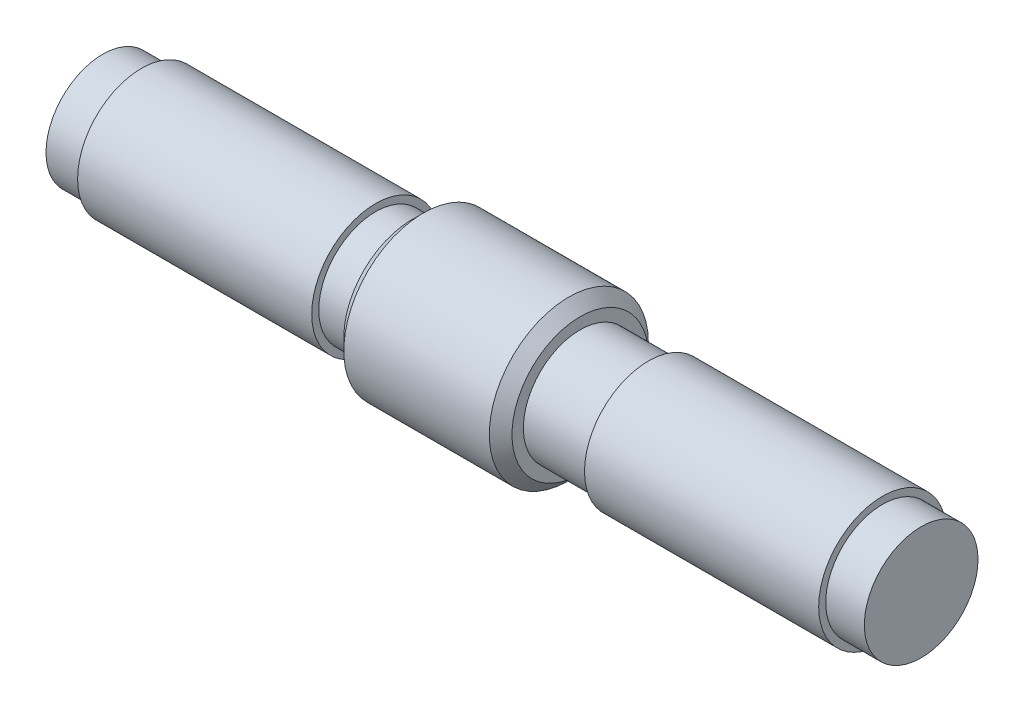
ISO-10303-21;
HEADER;
FILE_DESCRIPTION(('STEP AP214'),'2;1');
FILE_NAME('part.step','',(''),(''),'','','');
FILE_SCHEMA(('AUTOMOTIVE_DESIGN { 1 0 10303 214 1 1 1 1 }'));
ENDSEC;
DATA;
#1=APPLICATION_CONTEXT('core data for automotive mechanical design processes');
#2=APPLICATION_PROTOCOL_DEFINITION('international standard','automotive_design',2000,#1);
#3=PRODUCT_CONTEXT('',#1,'mechanical');
#4=PRODUCT('Part','Part','',(#3));
#5=PRODUCT_RELATED_PRODUCT_CATEGORY('part','',(#4));
#6=PRODUCT_DEFINITION_FORMATION('','',#4);
#7=PRODUCT_DEFINITION_CONTEXT('part definition',#1,'design');
#8=PRODUCT_DEFINITION('design','',#6,#7);
#9=PRODUCT_DEFINITION_SHAPE('','',#8);
#10=(LENGTH_UNIT() NAMED_UNIT(*) SI_UNIT(.MILLI.,.METRE.));
#11=(NAMED_UNIT(*) PLANE_ANGLE_UNIT() SI_UNIT($,.RADIAN.));
#12=(NAMED_UNIT(*) SI_UNIT($,.STERADIAN.) SOLID_ANGLE_UNIT());
#13=UNCERTAINTY_MEASURE_WITH_UNIT(LENGTH_MEASURE(1.E-05),#10,'distance_accuracy_value','');
#14=(GEOMETRIC_REPRESENTATION_CONTEXT(3) GLOBAL_UNCERTAINTY_ASSIGNED_CONTEXT((#13)) GLOBAL_UNIT_ASSIGNED_CONTEXT((#10,
#11,#12)) REPRESENTATION_CONTEXT('',''));
#15=CARTESIAN_POINT('',(0.,0.,0.));
#16=DIRECTION('',(0.,0.,1.));
#17=DIRECTION('',(1.,0.,0.));
#18=AXIS2_PLACEMENT_3D('',#15,#16,#17);
#19=CARTESIAN_POINT('',(187.,0.,0.));
#20=DIRECTION('',(-1.,0.,0.));
#21=DIRECTION('',(0.,0.,1.));
#22=AXIS2_PLACEMENT_3D('',#19,#20,#21);
#23=CYLINDRICAL_SURFACE('',#22,28.1);
#24=CARTESIAN_POINT('',(67.,0.,0.));
#25=DIRECTION('',(1.,0.,0.));
#26=DIRECTION('',(0.,0.,-1.));
#27=AXIS2_PLACEMENT_3D('',#24,#25,#26);
#28=CIRCLE('',#27,28.1);
#29=CARTESIAN_POINT('',(67.,0.,28.1));
#30=VERTEX_POINT('',#29);
#31=EDGE_CURVE('E290',#30,#30,#28,.T.);
#32=CARTESIAN_POINT('',(170.,0.,0.));
#33=DIRECTION('',(1.,0.,0.));
#34=DIRECTION('',(0.,0.,-1.));
#35=AXIS2_PLACEMENT_3D('',#32,#33,#34);
#36=CIRCLE('',#35,28.1);
#37=CARTESIAN_POINT('',(170.,0.,28.1));
#38=VERTEX_POINT('',#37);
#39=EDGE_CURVE('E273',#38,#38,#36,.T.);
#40=CARTESIAN_POINT('',(67.,0.,28.1));
#41=CARTESIAN_POINT('',(68.0729166666666,0.,28.1));
#42=CARTESIAN_POINT('',(69.1458333333333,0.,28.1));
#43=CARTESIAN_POINT('',(71.2916666666667,0.,28.1));
#44=CARTESIAN_POINT('',(72.3645833333333,0.,28.1));
#45=CARTESIAN_POINT('',(74.5104166666667,0.,28.1));
#46=CARTESIAN_POINT('',(75.5833333333333,0.,28.1));
#47=CARTESIAN_POINT('',(77.7291666666667,0.,28.1));
#48=CARTESIAN_POINT('',(78.8020833333333,0.,28.1));
#49=CARTESIAN_POINT('',(80.9479166666666,0.,28.1));
#50=CARTESIAN_POINT('',(82.0208333333333,0.,28.1));
#51=CARTESIAN_POINT('',(84.1666666666667,0.,28.1));
#52=CARTESIAN_POINT('',(85.2395833333333,0.,28.1));
#53=CARTESIAN_POINT('',(87.3854166666667,0.,28.1));
#54=CARTESIAN_POINT('',(88.4583333333333,0.,28.1));
#55=CARTESIAN_POINT('',(90.6041666666667,0.,28.1));
#56=CARTESIAN_POINT('',(91.6770833333333,0.,28.1));
#57=CARTESIAN_POINT('',(93.8229166666666,0.,28.1));
#58=CARTESIAN_POINT('',(94.8958333333333,0.,28.1));
#59=CARTESIAN_POINT('',(97.0416666666667,0.,28.1));
#60=CARTESIAN_POINT('',(98.1145833333333,0.,28.1));
#61=CARTESIAN_POINT('',(100.260416666667,0.,28.1));
#62=CARTESIAN_POINT('',(101.333333333333,0.,28.1));
#63=CARTESIAN_POINT('',(103.479166666667,0.,28.1));
#64=CARTESIAN_POINT('',(104.552083333333,0.,28.1));
#65=CARTESIAN_POINT('',(106.697916666667,0.,28.1));
#66=CARTESIAN_POINT('',(107.770833333333,0.,28.1));
#67=CARTESIAN_POINT('',(109.916666666667,0.,28.1));
#68=CARTESIAN_POINT('',(110.989583333333,0.,28.1));
#69=CARTESIAN_POINT('',(113.135416666667,0.,28.1));
#70=CARTESIAN_POINT('',(114.208333333333,0.,28.1));
#71=CARTESIAN_POINT('',(116.354166666667,0.,28.1));
#72=CARTESIAN_POINT('',(117.427083333333,0.,28.1));
#73=CARTESIAN_POINT('',(119.572916666667,0.,28.1));
#74=CARTESIAN_POINT('',(120.645833333333,0.,28.1));
#75=CARTESIAN_POINT('',(122.791666666667,0.,28.1));
#76=CARTESIAN_POINT('',(123.864583333333,0.,28.1));
#77=CARTESIAN_POINT('',(126.010416666667,0.,28.1));
#78=CARTESIAN_POINT('',(127.083333333333,0.,28.1));
#79=CARTESIAN_POINT('',(129.229166666667,0.,28.1));
#80=CARTESIAN_POINT('',(130.302083333333,0.,28.1));
#81=CARTESIAN_POINT('',(132.447916666667,0.,28.1));
#82=CARTESIAN_POINT('',(133.520833333333,0.,28.1));
#83=CARTESIAN_POINT('',(135.666666666667,0.,28.1));
#84=CARTESIAN_POINT('',(136.739583333333,0.,28.1));
#85=CARTESIAN_POINT('',(138.885416666667,0.,28.1));
#86=CARTESIAN_POINT('',(139.958333333333,0.,28.1));
#87=CARTESIAN_POINT('',(142.104166666667,0.,28.1));
#88=CARTESIAN_POINT('',(143.177083333333,0.,28.1));
#89=CARTESIAN_POINT('',(145.322916666667,0.,28.1));
#90=CARTESIAN_POINT('',(146.395833333333,0.,28.1));
#91=CARTESIAN_POINT('',(148.541666666667,0.,28.1));
#92=CARTESIAN_POINT('',(149.614583333333,0.,28.1));
#93=CARTESIAN_POINT('',(151.760416666667,0.,28.1));
#94=CARTESIAN_POINT('',(152.833333333333,0.,28.1));
#95=CARTESIAN_POINT('',(154.979166666667,0.,28.1));
#96=CARTESIAN_POINT('',(156.052083333333,0.,28.1));
#97=CARTESIAN_POINT('',(158.197916666667,0.,28.1));
#98=CARTESIAN_POINT('',(159.270833333333,0.,28.1));
#99=CARTESIAN_POINT('',(161.416666666667,0.,28.1));
#100=CARTESIAN_POINT('',(162.489583333333,0.,28.1));
#101=CARTESIAN_POINT('',(164.635416666667,0.,28.1));
#102=CARTESIAN_POINT('',(165.708333333333,0.,28.1));
#103=CARTESIAN_POINT('',(167.854166666667,0.,28.1));
#104=CARTESIAN_POINT('',(168.927083333333,0.,28.1));
#105=CARTESIAN_POINT('',(170.,0.,28.1));
#106=B_SPLINE_CURVE_WITH_KNOTS('',3,(#40,#41,#42,#43,#44,#45,#46,#47,#48,#49,#50,#51,#52,#53,
#54,#55,#56,#57,#58,#59,#60,#61,#62,#63,#64,#65,#66,#67,#68,#69,#70,#71,#72,#73,#74,#75,#76,#77,
#78,#79,#80,#81,#82,#83,#84,#85,#86,#87,#88,#89,#90,#91,#92,#93,#94,#95,#96,#97,#98,#99,#100,
#101,#102,#103,#104,#105),.UNSPECIFIED.,.F.,.F.,(4,2,2,2,2,2,2,2,2,2,2,2,2,2,2,2,2,2,2,2,2,2,2,
2,2,2,2,2,2,2,2,2,4),(0.,3.21874999999999,6.4375,9.65625000000001,12.875,16.09375,19.3125,
22.53125,25.75,28.96875,32.1875,35.40625,38.625,41.84375,45.0625,48.28125,51.5,54.71875,57.9375,
61.15625,64.375,67.59375,70.8125,74.03125,77.25,80.46875,83.6875,86.90625,90.125,93.34375,
96.5625,99.78125,103.),.UNSPECIFIED.);
#107=EDGE_CURVE('BSEAM39',#30,#38,#106,.T.);
#108=ORIENTED_EDGE('',*,*,#31,.T.);
#109=ORIENTED_EDGE('',*,*,#39,.F.);
#110=ORIENTED_EDGE('',*,*,#107,.T.);
#111=ORIENTED_EDGE('',*,*,#107,.F.);
#112=EDGE_LOOP('',(#108,#110,#109,#111));
#113=FACE_BOUND('',#112,.T.);
#114=ADVANCED_FACE('F39',(#113),#23,.T.);
#115=CARTESIAN_POINT('',(-173.,0.,0.));
#116=DIRECTION('',(1.,0.,0.));
#117=DIRECTION('',(0.,0.,-1.));
#118=AXIS2_PLACEMENT_3D('',#115,#116,#117);
#119=CYLINDRICAL_SURFACE('',#118,28.1);
#120=CARTESIAN_POINT('',(-53.,0.,0.));
#121=DIRECTION('',(-1.,0.,0.));
#122=DIRECTION('',(0.,0.,1.));
#123=AXIS2_PLACEMENT_3D('',#120,#121,#122);
#124=CIRCLE('',#123,28.1);
#125=CARTESIAN_POINT('',(-53.,0.,28.1));
#126=VERTEX_POINT('',#125);
#127=EDGE_CURVE('E60',#126,#126,#124,.T.);
#128=ORIENTED_EDGE('',*,*,#127,.T.);
#129=EDGE_LOOP('',(#128));
#130=FACE_BOUND('',#129,.T.);
#131=CARTESIAN_POINT('',(-156.,0.,0.));
#132=DIRECTION('',(-1.,0.,0.));
#133=DIRECTION('',(0.,0.,1.));
#134=AXIS2_PLACEMENT_3D('',#131,#132,#133);
#135=CIRCLE('',#134,28.1);
#136=CARTESIAN_POINT('',(-156.,0.,28.1));
#137=VERTEX_POINT('',#136);
#138=EDGE_CURVE('E284',#137,#137,#135,.T.);
#139=ORIENTED_EDGE('',*,*,#138,.F.);
#140=EDGE_LOOP('',(#139));
#141=FACE_BOUND('',#140,.T.);
#142=ADVANCED_FACE('F95',(#130,#141),#119,.T.);
#143=CARTESIAN_POINT('',(37.,0.,0.));
#144=DIRECTION('',(-1.,0.,0.));
#145=DIRECTION('',(0.,0.,1.));
#146=AXIS2_PLACEMENT_3D('',#143,#144,#145);
#147=CYLINDRICAL_SURFACE('',#146,35.);
#148=CARTESIAN_POINT('',(32.,0.,0.));
#149=DIRECTION('',(1.,0.,0.));
#150=DIRECTION('',(0.,0.,-1.));
#151=AXIS2_PLACEMENT_3D('',#148,#149,#150);
#152=CIRCLE('',#151,35.);
#153=CARTESIAN_POINT('',(32.,0.,-35.));
#154=VERTEX_POINT('',#153);
#155=EDGE_CURVE('E75',#154,#154,#152,.F.);
#156=ORIENTED_EDGE('',*,*,#155,.T.);
#157=EDGE_LOOP('',(#156));
#158=FACE_BOUND('',#157,.T.);
#159=CARTESIAN_POINT('',(-32.,0.,0.));
#160=DIRECTION('',(1.,0.,0.));
#161=DIRECTION('',(0.,0.,-1.));
#162=AXIS2_PLACEMENT_3D('',#159,#160,#161);
#163=CIRCLE('',#162,35.);
#164=CARTESIAN_POINT('',(-32.,0.,-35.));
#165=VERTEX_POINT('',#164);
#166=EDGE_CURVE('E72',#165,#165,#163,.T.);
#167=ORIENTED_EDGE('',*,*,#166,.T.);
#168=EDGE_LOOP('',(#167));
#169=FACE_BOUND('',#168,.T.);
#170=ADVANCED_FACE('F92',(#158,#169),#147,.T.);
#171=CARTESIAN_POINT('',(37.,0.,0.));
#172=DIRECTION('',(1.,0.,0.));
#173=DIRECTION('',(0.,0.,-1.));
#174=AXIS2_PLACEMENT_3D('',#171,#172,#173);
#175=PLANE('',#174);
#176=CARTESIAN_POINT('',(37.,0.,0.));
#177=DIRECTION('',(1.,0.,0.));
#178=DIRECTION('',(0.,0.,-1.));
#179=AXIS2_PLACEMENT_3D('',#176,#177,#178);
#180=CIRCLE('',#179,25.);
#181=CARTESIAN_POINT('',(37.,0.,-25.));
#182=VERTEX_POINT('',#181);
#183=EDGE_CURVE('E10',#182,#182,#180,.T.);
#184=ORIENTED_EDGE('',*,*,#183,.F.);
#185=EDGE_LOOP('',(#184));
#186=FACE_BOUND('',#185,.T.);
#187=CARTESIAN_POINT('',(37.,0.,0.));
#188=DIRECTION('',(1.,0.,0.));
#189=DIRECTION('',(0.,0.,-1.));
#190=AXIS2_PLACEMENT_3D('',#187,#188,#189);
#191=CIRCLE('',#190,30.);
#192=CARTESIAN_POINT('',(37.,0.,-30.));
#193=VERTEX_POINT('',#192);
#194=EDGE_CURVE('E67',#193,#193,#191,.T.);
#195=ORIENTED_EDGE('',*,*,#194,.T.);
#196=EDGE_LOOP('',(#195));
#197=FACE_BOUND('',#196,.T.);
#198=ADVANCED_FACE('F94',(#186,#197),#175,.T.);
#199=CARTESIAN_POINT('',(-37.,0.,0.));
#200=DIRECTION('',(1.,0.,0.));
#201=DIRECTION('',(0.,0.,-1.));
#202=AXIS2_PLACEMENT_3D('',#199,#200,#201);
#203=PLANE('',#202);
#204=CARTESIAN_POINT('',(-37.,0.,0.));
#205=DIRECTION('',(-1.,0.,0.));
#206=DIRECTION('',(0.,0.,1.));
#207=AXIS2_PLACEMENT_3D('',#204,#205,#206);
#208=CIRCLE('',#207,25.);
#209=CARTESIAN_POINT('',(-37.,0.,25.));
#210=VERTEX_POINT('',#209);
#211=EDGE_CURVE('E49',#210,#210,#208,.T.);
#212=ORIENTED_EDGE('',*,*,#211,.F.);
#213=EDGE_LOOP('',(#212));
#214=FACE_BOUND('',#213,.T.);
#215=CARTESIAN_POINT('',(-37.,0.,0.));
#216=DIRECTION('',(1.,0.,0.));
#217=DIRECTION('',(0.,0.,-1.));
#218=AXIS2_PLACEMENT_3D('',#215,#216,#217);
#219=CIRCLE('',#218,30.);
#220=CARTESIAN_POINT('',(-37.,0.,-30.));
#221=VERTEX_POINT('',#220);
#222=EDGE_CURVE('E44',#221,#221,#219,.F.);
#223=ORIENTED_EDGE('',*,*,#222,.T.);
#224=EDGE_LOOP('',(#223));
#225=FACE_BOUND('',#224,.T.);
#226=ADVANCED_FACE('F84',(#214,#225),#203,.F.);
#227=CARTESIAN_POINT('',(37.,0.,0.));
#228=DIRECTION('',(-1.,0.,0.));
#229=DIRECTION('',(0.,0.,1.));
#230=AXIS2_PLACEMENT_3D('',#227,#228,#229);
#231=CONICAL_SURFACE('',#230,30.,0.785398163397446);
#232=ORIENTED_EDGE('',*,*,#155,.F.);
#233=EDGE_LOOP('',(#232));
#234=FACE_BOUND('',#233,.T.);
#235=ORIENTED_EDGE('',*,*,#194,.F.);
#236=EDGE_LOOP('',(#235));
#237=FACE_BOUND('',#236,.T.);
#238=ADVANCED_FACE('F89',(#234,#237),#231,.T.);
#239=CARTESIAN_POINT('',(-32.,0.,0.));
#240=DIRECTION('',(1.,0.,0.));
#241=DIRECTION('',(0.,0.,-1.));
#242=AXIS2_PLACEMENT_3D('',#239,#240,#241);
#243=CONICAL_SURFACE('',#242,35.,0.78539816339745);
#244=ORIENTED_EDGE('',*,*,#222,.F.);
#245=EDGE_LOOP('',(#244));
#246=FACE_BOUND('',#245,.T.);
#247=ORIENTED_EDGE('',*,*,#166,.F.);
#248=EDGE_LOOP('',(#247));
#249=FACE_BOUND('',#248,.T.);
#250=ADVANCED_FACE('F42',(#246,#249),#243,.T.);
#251=CARTESIAN_POINT('',(-53.,0.,0.));
#252=DIRECTION('',(1.,0.,0.));
#253=DIRECTION('',(0.,0.,-1.));
#254=AXIS2_PLACEMENT_3D('',#251,#252,#253);
#255=CYLINDRICAL_SURFACE('',#254,25.);
#256=CARTESIAN_POINT('',(-53.,0.,0.));
#257=DIRECTION('',(-1.,0.,0.));
#258=DIRECTION('',(0.,0.,1.));
#259=AXIS2_PLACEMENT_3D('',#256,#257,#258);
#260=CIRCLE('',#259,25.);
#261=CARTESIAN_POINT('',(-53.,0.,25.));
#262=VERTEX_POINT('',#261);
#263=EDGE_CURVE('E64',#262,#262,#260,.T.);
#264=ORIENTED_EDGE('',*,*,#263,.F.);
#265=EDGE_LOOP('',(#264));
#266=FACE_BOUND('',#265,.T.);
#267=ORIENTED_EDGE('',*,*,#211,.T.);
#268=EDGE_LOOP('',(#267));
#269=FACE_BOUND('',#268,.T.);
#270=ADVANCED_FACE('F88',(#266,#269),#255,.T.);
#271=CARTESIAN_POINT('',(-53.,0.,0.));
#272=DIRECTION('',(-1.,0.,0.));
#273=DIRECTION('',(0.,0.,1.));
#274=AXIS2_PLACEMENT_3D('',#271,#272,#273);
#275=PLANE('',#274);
#276=ORIENTED_EDGE('',*,*,#263,.T.);
#277=EDGE_LOOP('',(#276));
#278=FACE_BOUND('',#277,.T.);
#279=ORIENTED_EDGE('',*,*,#127,.F.);
#280=EDGE_LOOP('',(#279));
#281=FACE_BOUND('',#280,.T.);
#282=ADVANCED_FACE('F120',(#278,#281),#275,.F.);
#283=CARTESIAN_POINT('',(67.,0.,0.));
#284=DIRECTION('',(-1.,0.,0.));
#285=DIRECTION('',(0.,0.,1.));
#286=AXIS2_PLACEMENT_3D('',#283,#284,#285);
#287=CYLINDRICAL_SURFACE('',#286,25.);
#288=CARTESIAN_POINT('',(67.,0.,0.));
#289=DIRECTION('',(1.,0.,0.));
#290=DIRECTION('',(0.,0.,-1.));
#291=AXIS2_PLACEMENT_3D('',#288,#289,#290);
#292=CIRCLE('',#291,25.);
#293=CARTESIAN_POINT('',(67.,0.,-25.));
#294=VERTEX_POINT('',#293);
#295=EDGE_CURVE('E58',#294,#294,#292,.T.);
#296=ORIENTED_EDGE('',*,*,#295,.F.);
#297=EDGE_LOOP('',(#296));
#298=FACE_BOUND('',#297,.T.);
#299=ORIENTED_EDGE('',*,*,#183,.T.);
#300=EDGE_LOOP('',(#299));
#301=FACE_BOUND('',#300,.T.);
#302=ADVANCED_FACE('F117',(#298,#301),#287,.T.);
#303=CARTESIAN_POINT('',(67.,0.,0.));
#304=DIRECTION('',(1.,0.,0.));
#305=DIRECTION('',(0.,0.,-1.));
#306=AXIS2_PLACEMENT_3D('',#303,#304,#305);
#307=PLANE('',#306);
#308=ORIENTED_EDGE('',*,*,#295,.T.);
#309=EDGE_LOOP('',(#308));
#310=FACE_BOUND('',#309,.T.);
#311=ORIENTED_EDGE('',*,*,#31,.F.);
#312=EDGE_LOOP('',(#311));
#313=FACE_BOUND('',#312,.T.);
#314=ADVANCED_FACE('F115',(#310,#313),#307,.F.);
#315=CARTESIAN_POINT('',(-156.,0.,0.));
#316=DIRECTION('',(-1.,0.,0.));
#317=DIRECTION('',(0.,0.,1.));
#318=AXIS2_PLACEMENT_3D('',#315,#316,#317);
#319=PLANE('',#318);
#320=CARTESIAN_POINT('',(-156.,0.,0.));
#321=DIRECTION('',(-1.,0.,0.));
#322=DIRECTION('',(0.,0.,1.));
#323=AXIS2_PLACEMENT_3D('',#320,#321,#322);
#324=CIRCLE('',#323,25.);
#325=CARTESIAN_POINT('',(-156.,0.,25.));
#326=VERTEX_POINT('',#325);
#327=EDGE_CURVE('E280',#326,#326,#324,.T.);
#328=ORIENTED_EDGE('',*,*,#327,.F.);
#329=EDGE_LOOP('',(#328));
#330=FACE_BOUND('',#329,.T.);
#331=ORIENTED_EDGE('',*,*,#138,.T.);
#332=EDGE_LOOP('',(#331));
#333=FACE_BOUND('',#332,.T.);
#334=ADVANCED_FACE('F174',(#330,#333),#319,.T.);
#335=CARTESIAN_POINT('',(-156.,0.,0.));
#336=DIRECTION('',(-1.,0.,0.));
#337=DIRECTION('',(0.,0.,1.));
#338=AXIS2_PLACEMENT_3D('',#335,#336,#337);
#339=CYLINDRICAL_SURFACE('',#338,25.);
#340=ORIENTED_EDGE('',*,*,#327,.T.);
#341=EDGE_LOOP('',(#340));
#342=FACE_BOUND('',#341,.T.);
#343=CARTESIAN_POINT('',(-173.,0.,0.));
#344=DIRECTION('',(-1.,0.,0.));
#345=DIRECTION('',(0.,0.,1.));
#346=AXIS2_PLACEMENT_3D('',#343,#344,#345);
#347=CIRCLE('',#346,25.);
#348=CARTESIAN_POINT('',(-173.,0.,25.));
#349=VERTEX_POINT('',#348);
#350=EDGE_CURVE('E279',#349,#349,#347,.T.);
#351=ORIENTED_EDGE('',*,*,#350,.F.);
#352=EDGE_LOOP('',(#351));
#353=FACE_BOUND('',#352,.T.);
#354=ADVANCED_FACE('F126',(#342,#353),#339,.T.);
#355=CARTESIAN_POINT('',(-173.,0.,0.));
#356=DIRECTION('',(-1.,0.,0.));
#357=DIRECTION('',(0.,0.,1.));
#358=AXIS2_PLACEMENT_3D('',#355,#356,#357);
#359=PLANE('',#358);
#360=ORIENTED_EDGE('',*,*,#350,.T.);
#361=EDGE_LOOP('',(#360));
#362=FACE_BOUND('',#361,.T.);
#363=ADVANCED_FACE('F122',(#362),#359,.T.);
#364=CARTESIAN_POINT('',(170.,0.,0.));
#365=DIRECTION('',(1.,0.,0.));
#366=DIRECTION('',(0.,0.,-1.));
#367=AXIS2_PLACEMENT_3D('',#364,#365,#366);
#368=PLANE('',#367);
#369=CARTESIAN_POINT('',(170.,0.,0.));
#370=DIRECTION('',(1.,0.,0.));
#371=DIRECTION('',(0.,0.,-1.));
#372=AXIS2_PLACEMENT_3D('',#369,#370,#371);
#373=CIRCLE('',#372,25.);
#374=CARTESIAN_POINT('',(170.,0.,-25.));
#375=VERTEX_POINT('',#374);
#376=EDGE_CURVE('E269',#375,#375,#373,.T.);
#377=ORIENTED_EDGE('',*,*,#376,.F.);
#378=EDGE_LOOP('',(#377));
#379=FACE_BOUND('',#378,.T.);
#380=ORIENTED_EDGE('',*,*,#39,.T.);
#381=EDGE_LOOP('',(#380));
#382=FACE_BOUND('',#381,.T.);
#383=ADVANCED_FACE('F125',(#379,#382),#368,.T.);
#384=CARTESIAN_POINT('',(170.,0.,0.));
#385=DIRECTION('',(1.,0.,0.));
#386=DIRECTION('',(0.,0.,-1.));
#387=AXIS2_PLACEMENT_3D('',#384,#385,#386);
#388=CYLINDRICAL_SURFACE('',#387,25.);
#389=ORIENTED_EDGE('',*,*,#376,.T.);
#390=EDGE_LOOP('',(#389));
#391=FACE_BOUND('',#390,.T.);
#392=CARTESIAN_POINT('',(187.,0.,0.));
#393=DIRECTION('',(1.,0.,0.));
#394=DIRECTION('',(0.,0.,-1.));
#395=AXIS2_PLACEMENT_3D('',#392,#393,#394);
#396=CIRCLE('',#395,25.);
#397=CARTESIAN_POINT('',(187.,0.,-25.));
#398=VERTEX_POINT('',#397);
#399=EDGE_CURVE('E266',#398,#398,#396,.T.);
#400=ORIENTED_EDGE('',*,*,#399,.F.);
#401=EDGE_LOOP('',(#400));
#402=FACE_BOUND('',#401,.T.);
#403=ADVANCED_FACE('F200',(#391,#402),#388,.T.);
#404=CARTESIAN_POINT('',(187.,0.,0.));
#405=DIRECTION('',(1.,0.,0.));
#406=DIRECTION('',(0.,0.,-1.));
#407=AXIS2_PLACEMENT_3D('',#404,#405,#406);
#408=PLANE('',#407);
#409=ORIENTED_EDGE('',*,*,#399,.T.);
#410=EDGE_LOOP('',(#409));
#411=FACE_BOUND('',#410,.T.);
#412=ADVANCED_FACE('F208',(#411),#408,.T.);
#413=CLOSED_SHELL('',(#114,#142,#170,#198,#226,#238,#250,#270,#282,#302,#314,#334,#354,#363,
#383,#403,#412));
#414=MANIFOLD_SOLID_BREP('B2',#413);
#415=ADVANCED_BREP_SHAPE_REPRESENTATION('',(#18,#414),#14);
#416=SHAPE_DEFINITION_REPRESENTATION(#9,#415);
ENDSEC;
END-ISO-10303-21;
